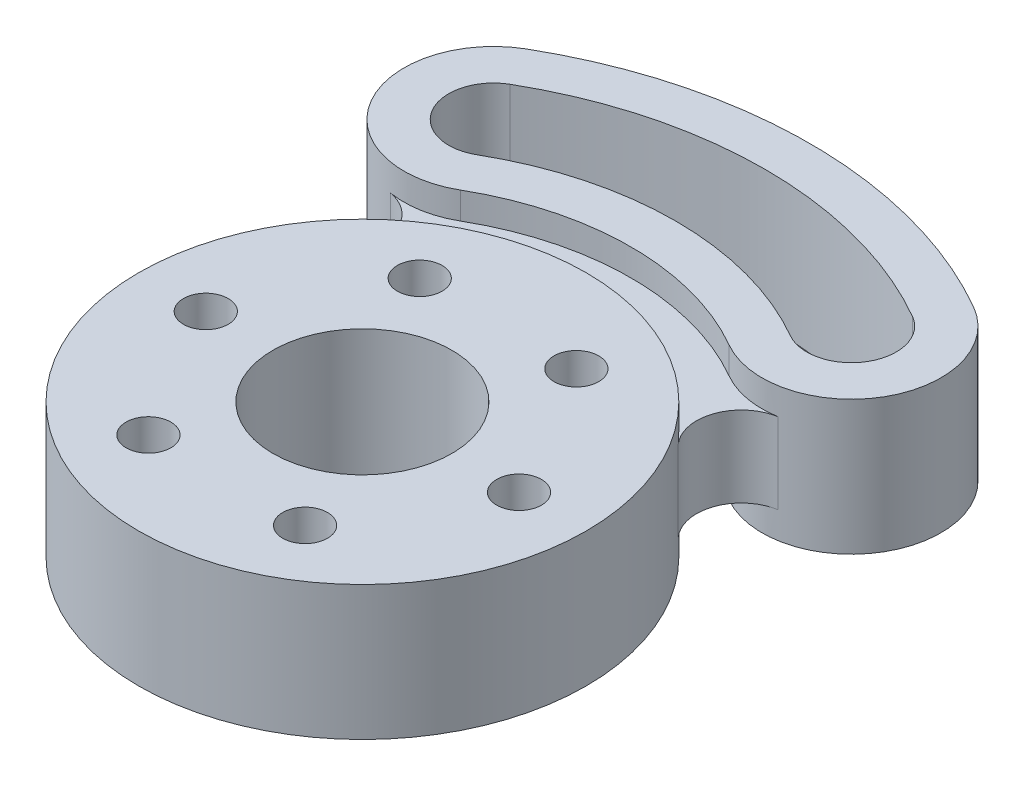
ISO-10303-21;
HEADER;
FILE_DESCRIPTION(('STEP AP214'),'2;1');
FILE_NAME('part.step','',(''),(''),'','','');
FILE_SCHEMA(('AUTOMOTIVE_DESIGN { 1 0 10303 214 1 1 1 1 }'));
ENDSEC;
DATA;
#1=APPLICATION_CONTEXT('core data for automotive mechanical design processes');
#2=APPLICATION_PROTOCOL_DEFINITION('international standard','automotive_design',2000,#1);
#3=PRODUCT_CONTEXT('',#1,'mechanical');
#4=PRODUCT('Part','Part','',(#3));
#5=PRODUCT_RELATED_PRODUCT_CATEGORY('part','',(#4));
#6=PRODUCT_DEFINITION_FORMATION('','',#4);
#7=PRODUCT_DEFINITION_CONTEXT('part definition',#1,'design');
#8=PRODUCT_DEFINITION('design','',#6,#7);
#9=PRODUCT_DEFINITION_SHAPE('','',#8);
#10=(LENGTH_UNIT() NAMED_UNIT(*) SI_UNIT(.MILLI.,.METRE.));
#11=(NAMED_UNIT(*) PLANE_ANGLE_UNIT() SI_UNIT($,.RADIAN.));
#12=(NAMED_UNIT(*) SI_UNIT($,.STERADIAN.) SOLID_ANGLE_UNIT());
#13=UNCERTAINTY_MEASURE_WITH_UNIT(LENGTH_MEASURE(1.E-05),#10,'distance_accuracy_value','');
#14=(GEOMETRIC_REPRESENTATION_CONTEXT(3) GLOBAL_UNCERTAINTY_ASSIGNED_CONTEXT((#13)) GLOBAL_UNIT_ASSIGNED_CONTEXT((#10,
#11,#12)) REPRESENTATION_CONTEXT('',''));
#15=CARTESIAN_POINT('',(0.,0.,0.));
#16=DIRECTION('',(0.,0.,1.));
#17=DIRECTION('',(1.,0.,0.));
#18=AXIS2_PLACEMENT_3D('',#15,#16,#17);
#19=CARTESIAN_POINT('',(0.,15.,0.));
#20=DIRECTION('',(0.,-1.,0.));
#21=DIRECTION('',(0.,0.,-1.));
#22=AXIS2_PLACEMENT_3D('',#19,#20,#21);
#23=CYLINDRICAL_SURFACE('',#22,60.);
#24=DIRECTION('',(0.,-1.,0.));
#25=VECTOR('',#24,1.);
#26=CARTESIAN_POINT('',(30.0000000000001,15.,-51.9615242270663));
#27=LINE('',#26,#25);
#28=CARTESIAN_POINT('',(30.0000000000001,-9.,-51.9615242270663));
#29=VERTEX_POINT('',#28);
#30=CARTESIAN_POINT('',(30.0000000000001,-15.,-51.9615242270663));
#31=VERTEX_POINT('',#30);
#32=EDGE_CURVE('E57',#29,#31,#27,.T.);
#33=ORIENTED_EDGE('',*,*,#32,.F.);
#34=CARTESIAN_POINT('',(0.,-9.,0.));
#35=DIRECTION('',(0.,1.,0.));
#36=DIRECTION('',(0.,0.,1.));
#37=AXIS2_PLACEMENT_3D('',#34,#35,#36);
#38=CIRCLE('',#37,60.);
#39=CARTESIAN_POINT('',(-30.0000000000001,-9.,-51.9615242270663));
#40=VERTEX_POINT('',#39);
#41=EDGE_CURVE('E174',#29,#40,#38,.T.);
#42=ORIENTED_EDGE('',*,*,#41,.T.);
#43=DIRECTION('',(0.,-1.,0.));
#44=VECTOR('',#43,1.);
#45=CARTESIAN_POINT('',(-30.0000000000001,15.,-51.9615242270663));
#46=LINE('',#45,#44);
#47=CARTESIAN_POINT('',(-30.0000000000001,-15.,-51.9615242270663));
#48=VERTEX_POINT('',#47);
#49=EDGE_CURVE('E241',#40,#48,#46,.T.);
#50=ORIENTED_EDGE('',*,*,#49,.T.);
#51=CARTESIAN_POINT('',(0.,-15.,0.));
#52=DIRECTION('',(0.,1.,0.));
#53=DIRECTION('',(0.,0.,1.));
#54=AXIS2_PLACEMENT_3D('',#51,#52,#53);
#55=CIRCLE('',#54,60.);
#56=EDGE_CURVE('E226',#31,#48,#55,.T.);
#57=ORIENTED_EDGE('',*,*,#56,.F.);
#58=EDGE_LOOP('',(#33,#42,#50,#57));
#59=FACE_BOUND('',#58,.T.);
#60=ADVANCED_FACE('F48',(#59),#23,.F.);
#61=CARTESIAN_POINT('',(0.,9.,0.));
#62=DIRECTION('',(0.,1.,0.));
#63=DIRECTION('',(0.,0.,1.));
#64=AXIS2_PLACEMENT_3D('',#61,#62,#63);
#65=CIRCLE('',#64,60.);
#66=CARTESIAN_POINT('',(30.0000000000001,9.,-51.9615242270663));
#67=VERTEX_POINT('',#66);
#68=CARTESIAN_POINT('',(-30.0000000000001,9.,-51.9615242270663));
#69=VERTEX_POINT('',#68);
#70=EDGE_CURVE('E277',#67,#69,#65,.T.);
#71=ORIENTED_EDGE('',*,*,#70,.F.);
#72=CARTESIAN_POINT('',(30.0000000000001,15.,-51.9615242270663));
#73=VERTEX_POINT('',#72);
#74=EDGE_CURVE('E12',#73,#67,#27,.T.);
#75=ORIENTED_EDGE('',*,*,#74,.F.);
#76=CARTESIAN_POINT('',(0.,15.,0.));
#77=DIRECTION('',(0.,1.,0.));
#78=DIRECTION('',(0.,0.,1.));
#79=AXIS2_PLACEMENT_3D('',#76,#77,#78);
#80=CIRCLE('',#79,60.);
#81=CARTESIAN_POINT('',(-30.0000000000001,15.,-51.9615242270663));
#82=VERTEX_POINT('',#81);
#83=EDGE_CURVE('E203',#73,#82,#80,.T.);
#84=ORIENTED_EDGE('',*,*,#83,.T.);
#85=EDGE_CURVE('E237',#82,#69,#46,.T.);
#86=ORIENTED_EDGE('',*,*,#85,.T.);
#87=EDGE_LOOP('',(#71,#75,#84,#86));
#88=FACE_BOUND('',#87,.T.);
#89=ADVANCED_FACE('F366',(#88),#23,.F.);
#90=CARTESIAN_POINT('',(40.0000000000001,15.,-69.282032302755));
#91=DIRECTION('',(0.,-1.,0.));
#92=DIRECTION('',(0.,0.,-1.));
#93=AXIS2_PLACEMENT_3D('',#90,#91,#92);
#94=CYLINDRICAL_SURFACE('',#93,20.);
#95=ORIENTED_EDGE('',*,*,#74,.T.);
#96=CARTESIAN_POINT('',(40.0000000000001,9.,-69.282032302755));
#97=DIRECTION('',(0.,1.,0.));
#98=DIRECTION('',(0.,0.,1.));
#99=AXIS2_PLACEMENT_3D('',#96,#97,#98);
#100=CIRCLE('',#99,20.);
#101=CARTESIAN_POINT('',(43.3254688973879,9.,-49.560438639653));
#102=VERTEX_POINT('',#101);
#103=EDGE_CURVE('E64',#67,#102,#100,.T.);
#104=ORIENTED_EDGE('',*,*,#103,.T.);
#105=DIRECTION('',(0.,-1.,0.));
#106=VECTOR('',#105,1.);
#107=CARTESIAN_POINT('',(43.3254688973879,9.,-49.560438639653));
#108=LINE('',#107,#106);
#109=CARTESIAN_POINT('',(43.3254688973879,-9.,-49.560438639653));
#110=VERTEX_POINT('',#109);
#111=EDGE_CURVE('E68',#102,#110,#108,.T.);
#112=ORIENTED_EDGE('',*,*,#111,.T.);
#113=CARTESIAN_POINT('',(40.0000000000001,-9.,-69.282032302755));
#114=DIRECTION('',(0.,1.,0.));
#115=DIRECTION('',(0.,0.,1.));
#116=AXIS2_PLACEMENT_3D('',#113,#114,#115);
#117=CIRCLE('',#116,20.);
#118=EDGE_CURVE('E172',#29,#110,#117,.T.);
#119=ORIENTED_EDGE('',*,*,#118,.F.);
#120=ORIENTED_EDGE('',*,*,#32,.T.);
#121=CARTESIAN_POINT('',(40.0000000000001,-15.,-69.282032302755));
#122=DIRECTION('',(0.,1.,0.));
#123=DIRECTION('',(0.,0.,1.));
#124=AXIS2_PLACEMENT_3D('',#121,#122,#123);
#125=CIRCLE('',#124,20.);
#126=CARTESIAN_POINT('',(50.0000000000001,-15.,-86.6025403784438));
#127=VERTEX_POINT('',#126);
#128=EDGE_CURVE('E229',#31,#127,#125,.T.);
#129=ORIENTED_EDGE('',*,*,#128,.T.);
#130=DIRECTION('',(0.,-1.,0.));
#131=VECTOR('',#130,1.);
#132=CARTESIAN_POINT('',(50.0000000000001,15.,-86.6025403784438));
#133=LINE('',#132,#131);
#134=CARTESIAN_POINT('',(50.0000000000001,15.,-86.6025403784438));
#135=VERTEX_POINT('',#134);
#136=EDGE_CURVE('E244',#135,#127,#133,.T.);
#137=ORIENTED_EDGE('',*,*,#136,.F.);
#138=CARTESIAN_POINT('',(40.0000000000001,15.,-69.282032302755));
#139=DIRECTION('',(0.,1.,0.));
#140=DIRECTION('',(0.,0.,1.));
#141=AXIS2_PLACEMENT_3D('',#138,#139,#140);
#142=CIRCLE('',#141,20.);
#143=EDGE_CURVE('E206',#73,#135,#142,.T.);
#144=ORIENTED_EDGE('',*,*,#143,.F.);
#145=EDGE_LOOP('',(#95,#104,#112,#119,#120,#129,#137,#144));
#146=FACE_BOUND('',#145,.T.);
#147=ADVANCED_FACE('F265',(#146),#94,.T.);
#148=CARTESIAN_POINT('',(0.,15.,0.));
#149=DIRECTION('',(0.,-1.,0.));
#150=DIRECTION('',(0.,0.,-1.));
#151=AXIS2_PLACEMENT_3D('',#148,#149,#150);
#152=CYLINDRICAL_SURFACE('',#151,100.);
#153=CARTESIAN_POINT('',(0.,-15.,0.));
#154=DIRECTION('',(0.,1.,0.));
#155=DIRECTION('',(0.,0.,1.));
#156=AXIS2_PLACEMENT_3D('',#153,#154,#155);
#157=CIRCLE('',#156,100.);
#158=CARTESIAN_POINT('',(-50.0000000000001,-15.,-86.6025403784438));
#159=VERTEX_POINT('',#158);
#160=EDGE_CURVE('E232',#127,#159,#157,.T.);
#161=ORIENTED_EDGE('',*,*,#160,.T.);
#162=DIRECTION('',(0.,-1.,0.));
#163=VECTOR('',#162,1.);
#164=CARTESIAN_POINT('',(-50.0000000000001,15.,-86.6025403784438));
#165=LINE('',#164,#163);
#166=CARTESIAN_POINT('',(-50.0000000000001,15.,-86.6025403784438));
#167=VERTEX_POINT('',#166);
#168=EDGE_CURVE('E240',#167,#159,#165,.T.);
#169=ORIENTED_EDGE('',*,*,#168,.F.);
#170=CARTESIAN_POINT('',(0.,15.,0.));
#171=DIRECTION('',(0.,1.,0.));
#172=DIRECTION('',(0.,0.,1.));
#173=AXIS2_PLACEMENT_3D('',#170,#171,#172);
#174=CIRCLE('',#173,100.);
#175=EDGE_CURVE('E209',#135,#167,#174,.T.);
#176=ORIENTED_EDGE('',*,*,#175,.F.);
#177=ORIENTED_EDGE('',*,*,#136,.T.);
#178=EDGE_LOOP('',(#161,#169,#176,#177));
#179=FACE_BOUND('',#178,.T.);
#180=ADVANCED_FACE('F386',(#179),#152,.T.);
#181=CARTESIAN_POINT('',(-40.0000000000001,15.,-69.282032302755));
#182=DIRECTION('',(0.,-1.,0.));
#183=DIRECTION('',(0.,0.,-1.));
#184=AXIS2_PLACEMENT_3D('',#181,#182,#183);
#185=CYLINDRICAL_SURFACE('',#184,10.);
#186=CARTESIAN_POINT('',(-40.0000000000001,-15.,-69.282032302755));
#187=DIRECTION('',(0.,1.,0.));
#188=DIRECTION('',(0.,0.,1.));
#189=AXIS2_PLACEMENT_3D('',#186,#187,#188);
#190=CIRCLE('',#189,10.);
#191=CARTESIAN_POINT('',(-45.0000000000001,-15.,-77.9422863405995));
#192=VERTEX_POINT('',#191);
#193=CARTESIAN_POINT('',(-35.0000000000001,-15.,-60.6217782649107));
#194=VERTEX_POINT('',#193);
#195=EDGE_CURVE('E190',#192,#194,#190,.T.);
#196=ORIENTED_EDGE('',*,*,#195,.F.);
#197=DIRECTION('',(0.,-1.,0.));
#198=VECTOR('',#197,1.);
#199=CARTESIAN_POINT('',(-45.0000000000001,15.,-77.9422863405995));
#200=LINE('',#199,#198);
#201=CARTESIAN_POINT('',(-45.0000000000001,15.,-77.9422863405995));
#202=VERTEX_POINT('',#201);
#203=EDGE_CURVE('E52',#202,#192,#200,.T.);
#204=ORIENTED_EDGE('',*,*,#203,.F.);
#205=CARTESIAN_POINT('',(-40.0000000000001,15.,-69.282032302755));
#206=DIRECTION('',(0.,1.,0.));
#207=DIRECTION('',(0.,0.,1.));
#208=AXIS2_PLACEMENT_3D('',#205,#206,#207);
#209=CIRCLE('',#208,10.);
#210=CARTESIAN_POINT('',(-35.0000000000001,15.,-60.6217782649107));
#211=VERTEX_POINT('',#210);
#212=EDGE_CURVE('E191',#202,#211,#209,.T.);
#213=ORIENTED_EDGE('',*,*,#212,.T.);
#214=DIRECTION('',(0.,-1.,0.));
#215=VECTOR('',#214,1.);
#216=CARTESIAN_POINT('',(-35.0000000000001,15.,-60.6217782649107));
#217=LINE('',#216,#215);
#218=EDGE_CURVE('E214',#211,#194,#217,.T.);
#219=ORIENTED_EDGE('',*,*,#218,.T.);
#220=EDGE_LOOP('',(#196,#204,#213,#219));
#221=FACE_BOUND('',#220,.T.);
#222=ADVANCED_FACE('F50',(#221),#185,.F.);
#223=CARTESIAN_POINT('',(0.,15.,0.));
#224=DIRECTION('',(0.,-1.,0.));
#225=DIRECTION('',(0.,0.,-1.));
#226=AXIS2_PLACEMENT_3D('',#223,#224,#225);
#227=CYLINDRICAL_SURFACE('',#226,90.0000000000001);
#228=CARTESIAN_POINT('',(0.,-15.,0.));
#229=DIRECTION('',(0.,1.,0.));
#230=DIRECTION('',(0.,0.,1.));
#231=AXIS2_PLACEMENT_3D('',#228,#229,#230);
#232=CIRCLE('',#231,90.0000000000001);
#233=CARTESIAN_POINT('',(45.0000000000002,-15.,-77.9422863405995));
#234=VERTEX_POINT('',#233);
#235=EDGE_CURVE('E217',#234,#192,#232,.T.);
#236=ORIENTED_EDGE('',*,*,#235,.F.);
#237=DIRECTION('',(0.,-1.,0.));
#238=VECTOR('',#237,1.);
#239=CARTESIAN_POINT('',(45.0000000000002,15.,-77.9422863405995));
#240=LINE('',#239,#238);
#241=CARTESIAN_POINT('',(45.0000000000002,15.,-77.9422863405995));
#242=VERTEX_POINT('',#241);
#243=EDGE_CURVE('E249',#242,#234,#240,.T.);
#244=ORIENTED_EDGE('',*,*,#243,.F.);
#245=CARTESIAN_POINT('',(0.,15.,0.));
#246=DIRECTION('',(0.,1.,0.));
#247=DIRECTION('',(0.,0.,1.));
#248=AXIS2_PLACEMENT_3D('',#245,#246,#247);
#249=CIRCLE('',#248,90.0000000000001);
#250=EDGE_CURVE('E194',#242,#202,#249,.T.);
#251=ORIENTED_EDGE('',*,*,#250,.T.);
#252=ORIENTED_EDGE('',*,*,#203,.T.);
#253=EDGE_LOOP('',(#236,#244,#251,#252));
#254=FACE_BOUND('',#253,.T.);
#255=ADVANCED_FACE('F381',(#254),#227,.F.);
#256=CARTESIAN_POINT('',(40.0000000000001,15.,-69.282032302755));
#257=DIRECTION('',(0.,-1.,0.));
#258=DIRECTION('',(0.,0.,-1.));
#259=AXIS2_PLACEMENT_3D('',#256,#257,#258);
#260=CYLINDRICAL_SURFACE('',#259,10.);
#261=CARTESIAN_POINT('',(40.0000000000001,-15.,-69.282032302755));
#262=DIRECTION('',(0.,1.,0.));
#263=DIRECTION('',(0.,0.,1.));
#264=AXIS2_PLACEMENT_3D('',#261,#262,#263);
#265=CIRCLE('',#264,10.);
#266=CARTESIAN_POINT('',(35.0000000000001,-15.,-60.6217782649107));
#267=VERTEX_POINT('',#266);
#268=EDGE_CURVE('E220',#267,#234,#265,.T.);
#269=ORIENTED_EDGE('',*,*,#268,.F.);
#270=DIRECTION('',(0.,-1.,0.));
#271=VECTOR('',#270,1.);
#272=CARTESIAN_POINT('',(35.0000000000001,15.,-60.6217782649107));
#273=LINE('',#272,#271);
#274=CARTESIAN_POINT('',(35.0000000000001,15.,-60.6217782649107));
#275=VERTEX_POINT('',#274);
#276=EDGE_CURVE('E248',#275,#267,#273,.T.);
#277=ORIENTED_EDGE('',*,*,#276,.F.);
#278=CARTESIAN_POINT('',(40.0000000000001,15.,-69.282032302755));
#279=DIRECTION('',(0.,1.,0.));
#280=DIRECTION('',(0.,0.,1.));
#281=AXIS2_PLACEMENT_3D('',#278,#279,#280);
#282=CIRCLE('',#281,10.);
#283=EDGE_CURVE('E198',#275,#242,#282,.T.);
#284=ORIENTED_EDGE('',*,*,#283,.T.);
#285=ORIENTED_EDGE('',*,*,#243,.T.);
#286=EDGE_LOOP('',(#269,#277,#284,#285));
#287=FACE_BOUND('',#286,.T.);
#288=ADVANCED_FACE('F378',(#287),#260,.F.);
#289=CARTESIAN_POINT('',(0.,15.,0.));
#290=DIRECTION('',(0.,-1.,0.));
#291=DIRECTION('',(0.,0.,-1.));
#292=AXIS2_PLACEMENT_3D('',#289,#290,#291);
#293=CYLINDRICAL_SURFACE('',#292,70.);
#294=CARTESIAN_POINT('',(0.,-15.,0.));
#295=DIRECTION('',(0.,1.,0.));
#296=DIRECTION('',(0.,0.,1.));
#297=AXIS2_PLACEMENT_3D('',#294,#295,#296);
#298=CIRCLE('',#297,70.);
#299=EDGE_CURVE('E223',#267,#194,#298,.T.);
#300=ORIENTED_EDGE('',*,*,#299,.T.);
#301=ORIENTED_EDGE('',*,*,#218,.F.);
#302=CARTESIAN_POINT('',(0.,15.,0.));
#303=DIRECTION('',(0.,1.,0.));
#304=DIRECTION('',(0.,0.,1.));
#305=AXIS2_PLACEMENT_3D('',#302,#303,#304);
#306=CIRCLE('',#305,70.);
#307=EDGE_CURVE('E201',#275,#211,#306,.T.);
#308=ORIENTED_EDGE('',*,*,#307,.F.);
#309=ORIENTED_EDGE('',*,*,#276,.T.);
#310=EDGE_LOOP('',(#300,#301,#308,#309));
#311=FACE_BOUND('',#310,.T.);
#312=ADVANCED_FACE('F375',(#311),#293,.T.);
#313=CARTESIAN_POINT('',(-40.0000000000001,15.,-69.282032302755));
#314=DIRECTION('',(0.,-1.,0.));
#315=DIRECTION('',(0.,0.,-1.));
#316=AXIS2_PLACEMENT_3D('',#313,#314,#315);
#317=CYLINDRICAL_SURFACE('',#316,20.);
#318=DIRECTION('',(0.,-1.,0.));
#319=VECTOR('',#318,1.);
#320=CARTESIAN_POINT('',(-43.3254688973879,9.,-49.560438639653));
#321=LINE('',#320,#319);
#322=CARTESIAN_POINT('',(-43.3254688973879,9.,-49.560438639653));
#323=VERTEX_POINT('',#322);
#324=CARTESIAN_POINT('',(-43.3254688973879,-9.,-49.560438639653));
#325=VERTEX_POINT('',#324);
#326=EDGE_CURVE('E184',#323,#325,#321,.T.);
#327=ORIENTED_EDGE('',*,*,#326,.F.);
#328=CARTESIAN_POINT('',(-40.0000000000001,9.,-69.282032302755));
#329=DIRECTION('',(0.,1.,0.));
#330=DIRECTION('',(0.,0.,1.));
#331=AXIS2_PLACEMENT_3D('',#328,#329,#330);
#332=CIRCLE('',#331,20.);
#333=EDGE_CURVE('E187',#323,#69,#332,.T.);
#334=ORIENTED_EDGE('',*,*,#333,.T.);
#335=ORIENTED_EDGE('',*,*,#85,.F.);
#336=CARTESIAN_POINT('',(-40.0000000000001,15.,-69.282032302755));
#337=DIRECTION('',(0.,1.,0.));
#338=DIRECTION('',(0.,0.,1.));
#339=AXIS2_PLACEMENT_3D('',#336,#337,#338);
#340=CIRCLE('',#339,20.);
#341=EDGE_CURVE('E212',#167,#82,#340,.T.);
#342=ORIENTED_EDGE('',*,*,#341,.F.);
#343=ORIENTED_EDGE('',*,*,#168,.T.);
#344=CARTESIAN_POINT('',(-40.0000000000001,-15.,-69.282032302755));
#345=DIRECTION('',(0.,1.,0.));
#346=DIRECTION('',(0.,0.,1.));
#347=AXIS2_PLACEMENT_3D('',#344,#345,#346);
#348=CIRCLE('',#347,20.);
#349=EDGE_CURVE('E195',#159,#48,#348,.T.);
#350=ORIENTED_EDGE('',*,*,#349,.T.);
#351=ORIENTED_EDGE('',*,*,#49,.F.);
#352=CARTESIAN_POINT('',(-40.0000000000001,-9.,-69.282032302755));
#353=DIRECTION('',(0.,1.,0.));
#354=DIRECTION('',(0.,0.,1.));
#355=AXIS2_PLACEMENT_3D('',#352,#353,#354);
#356=CIRCLE('',#355,20.);
#357=EDGE_CURVE('E180',#325,#40,#356,.T.);
#358=ORIENTED_EDGE('',*,*,#357,.F.);
#359=EDGE_LOOP('',(#327,#334,#335,#342,#343,#350,#351,#358));
#360=FACE_BOUND('',#359,.T.);
#361=ADVANCED_FACE('F259',(#360),#317,.T.);
#362=CARTESIAN_POINT('',(0.,15.,0.));
#363=DIRECTION('',(0.,1.,0.));
#364=DIRECTION('',(0.,0.,1.));
#365=AXIS2_PLACEMENT_3D('',#362,#363,#364);
#366=PLANE('',#365);
#367=ORIENTED_EDGE('',*,*,#212,.F.);
#368=ORIENTED_EDGE('',*,*,#250,.F.);
#369=ORIENTED_EDGE('',*,*,#283,.F.);
#370=ORIENTED_EDGE('',*,*,#307,.T.);
#371=EDGE_LOOP('',(#367,#368,#369,#370));
#372=FACE_BOUND('',#371,.T.);
#373=ORIENTED_EDGE('',*,*,#83,.F.);
#374=ORIENTED_EDGE('',*,*,#143,.T.);
#375=ORIENTED_EDGE('',*,*,#175,.T.);
#376=ORIENTED_EDGE('',*,*,#341,.T.);
#377=EDGE_LOOP('',(#373,#374,#375,#376));
#378=FACE_BOUND('',#377,.T.);
#379=ADVANCED_FACE('F396',(#372,#378),#366,.T.);
#380=CARTESIAN_POINT('',(0.,-15.,0.));
#381=DIRECTION('',(0.,1.,0.));
#382=DIRECTION('',(0.,0.,1.));
#383=AXIS2_PLACEMENT_3D('',#380,#381,#382);
#384=PLANE('',#383);
#385=ORIENTED_EDGE('',*,*,#195,.T.);
#386=ORIENTED_EDGE('',*,*,#299,.F.);
#387=ORIENTED_EDGE('',*,*,#268,.T.);
#388=ORIENTED_EDGE('',*,*,#235,.T.);
#389=EDGE_LOOP('',(#385,#386,#387,#388));
#390=FACE_BOUND('',#389,.T.);
#391=ORIENTED_EDGE('',*,*,#56,.T.);
#392=ORIENTED_EDGE('',*,*,#349,.F.);
#393=ORIENTED_EDGE('',*,*,#160,.F.);
#394=ORIENTED_EDGE('',*,*,#128,.F.);
#395=EDGE_LOOP('',(#391,#392,#393,#394));
#396=FACE_BOUND('',#395,.T.);
#397=ADVANCED_FACE('F263',(#390,#396),#384,.F.);
#398=CARTESIAN_POINT('',(-44.9882033460818,9.,-39.699641808102));
#399=DIRECTION('',(0.,-1.,0.));
#400=DIRECTION('',(0.,0.,-1.));
#401=AXIS2_PLACEMENT_3D('',#398,#399,#400);
#402=CYLINDRICAL_SURFACE('',#401,10.);
#403=CARTESIAN_POINT('',(-44.9882033460818,-9.,-39.699641808102));
#404=DIRECTION('',(0.,1.,0.));
#405=DIRECTION('',(0.,0.,1.));
#406=AXIS2_PLACEMENT_3D('',#403,#404,#405);
#407=CIRCLE('',#406,10.);
#408=CARTESIAN_POINT('',(-37.4901694550682,-9.,-33.083034840085));
#409=VERTEX_POINT('',#408);
#410=EDGE_CURVE('E161',#409,#325,#407,.T.);
#411=ORIENTED_EDGE('',*,*,#410,.F.);
#412=DIRECTION('',(0.,-1.,0.));
#413=VECTOR('',#412,1.);
#414=CARTESIAN_POINT('',(-37.4901694550682,9.,-33.083034840085));
#415=LINE('',#414,#413);
#416=CARTESIAN_POINT('',(-37.4901694550682,9.,-33.083034840085));
#417=VERTEX_POINT('',#416);
#418=EDGE_CURVE('E155',#417,#409,#415,.T.);
#419=ORIENTED_EDGE('',*,*,#418,.F.);
#420=CARTESIAN_POINT('',(-44.9882033460818,9.,-39.699641808102));
#421=DIRECTION('',(0.,1.,0.));
#422=DIRECTION('',(0.,0.,1.));
#423=AXIS2_PLACEMENT_3D('',#420,#421,#422);
#424=CIRCLE('',#423,10.);
#425=EDGE_CURVE('E183',#417,#323,#424,.T.);
#426=ORIENTED_EDGE('',*,*,#425,.T.);
#427=ORIENTED_EDGE('',*,*,#326,.T.);
#428=EDGE_LOOP('',(#411,#419,#426,#427));
#429=FACE_BOUND('',#428,.T.);
#430=ADVANCED_FACE('F269',(#429),#402,.F.);
#431=CARTESIAN_POINT('',(44.9882033460818,9.,-39.699641808102));
#432=DIRECTION('',(0.,-1.,0.));
#433=DIRECTION('',(0.,0.,-1.));
#434=AXIS2_PLACEMENT_3D('',#431,#432,#433);
#435=CYLINDRICAL_SURFACE('',#434,10.);
#436=CARTESIAN_POINT('',(44.9882033460818,-9.,-39.699641808102));
#437=DIRECTION('',(0.,1.,0.));
#438=DIRECTION('',(0.,0.,1.));
#439=AXIS2_PLACEMENT_3D('',#436,#437,#438);
#440=CIRCLE('',#439,10.);
#441=CARTESIAN_POINT('',(37.4901694550682,-9.,-33.083034840085));
#442=VERTEX_POINT('',#441);
#443=EDGE_CURVE('E160',#110,#442,#440,.T.);
#444=ORIENTED_EDGE('',*,*,#443,.F.);
#445=ORIENTED_EDGE('',*,*,#111,.F.);
#446=CARTESIAN_POINT('',(44.9882033460818,9.,-39.699641808102));
#447=DIRECTION('',(0.,1.,0.));
#448=DIRECTION('',(0.,0.,1.));
#449=AXIS2_PLACEMENT_3D('',#446,#447,#448);
#450=CIRCLE('',#449,10.);
#451=CARTESIAN_POINT('',(37.4901694550682,9.,-33.083034840085));
#452=VERTEX_POINT('',#451);
#453=EDGE_CURVE('E168',#102,#452,#450,.T.);
#454=ORIENTED_EDGE('',*,*,#453,.T.);
#455=DIRECTION('',(0.,-1.,0.));
#456=VECTOR('',#455,1.);
#457=CARTESIAN_POINT('',(37.4901694550682,9.,-33.083034840085));
#458=LINE('',#457,#456);
#459=EDGE_CURVE('E152',#452,#442,#458,.T.);
#460=ORIENTED_EDGE('',*,*,#459,.T.);
#461=EDGE_LOOP('',(#444,#445,#454,#460));
#462=FACE_BOUND('',#461,.T.);
#463=ADVANCED_FACE('F165',(#462),#435,.F.);
#464=CARTESIAN_POINT('',(0.,9.,0.));
#465=DIRECTION('',(0.,1.,0.));
#466=DIRECTION('',(0.,0.,1.));
#467=AXIS2_PLACEMENT_3D('',#464,#465,#466);
#468=PLANE('',#467);
#469=ORIENTED_EDGE('',*,*,#425,.F.);
#470=CARTESIAN_POINT('',(0.,9.,0.));
#471=DIRECTION('',(0.,1.,0.));
#472=DIRECTION('',(0.,0.,1.));
#473=AXIS2_PLACEMENT_3D('',#470,#471,#472);
#474=CIRCLE('',#473,50.);
#475=EDGE_CURVE('E273',#452,#417,#474,.T.);
#476=ORIENTED_EDGE('',*,*,#475,.F.);
#477=ORIENTED_EDGE('',*,*,#453,.F.);
#478=ORIENTED_EDGE('',*,*,#103,.F.);
#479=ORIENTED_EDGE('',*,*,#70,.T.);
#480=ORIENTED_EDGE('',*,*,#333,.F.);
#481=EDGE_LOOP('',(#469,#476,#477,#478,#479,#480));
#482=FACE_BOUND('',#481,.T.);
#483=ADVANCED_FACE('F276',(#482),#468,.T.);
#484=CARTESIAN_POINT('',(0.,-9.,0.));
#485=DIRECTION('',(0.,1.,0.));
#486=DIRECTION('',(0.,0.,1.));
#487=AXIS2_PLACEMENT_3D('',#484,#485,#486);
#488=PLANE('',#487);
#489=ORIENTED_EDGE('',*,*,#410,.T.);
#490=ORIENTED_EDGE('',*,*,#357,.T.);
#491=ORIENTED_EDGE('',*,*,#41,.F.);
#492=ORIENTED_EDGE('',*,*,#118,.T.);
#493=ORIENTED_EDGE('',*,*,#443,.T.);
#494=CARTESIAN_POINT('',(0.,-9.,0.));
#495=DIRECTION('',(0.,1.,0.));
#496=DIRECTION('',(0.,0.,1.));
#497=AXIS2_PLACEMENT_3D('',#494,#495,#496);
#498=CIRCLE('',#497,50.);
#499=EDGE_CURVE('E148',#442,#409,#498,.T.);
#500=ORIENTED_EDGE('',*,*,#499,.T.);
#501=EDGE_LOOP('',(#489,#490,#491,#492,#493,#500));
#502=FACE_BOUND('',#501,.T.);
#503=ADVANCED_FACE('F170',(#502),#488,.F.);
#504=CARTESIAN_POINT('',(0.,15.,0.));
#505=DIRECTION('',(0.,-1.,0.));
#506=DIRECTION('',(0.,0.,-1.));
#507=AXIS2_PLACEMENT_3D('',#504,#505,#506);
#508=CYLINDRICAL_SURFACE('',#507,20.);
#509=CARTESIAN_POINT('',(0.,15.,0.));
#510=DIRECTION('',(0.,1.,0.));
#511=DIRECTION('',(0.,0.,1.));
#512=AXIS2_PLACEMENT_3D('',#509,#510,#511);
#513=CIRCLE('',#512,20.);
#514=CARTESIAN_POINT('',(0.,15.,20.));
#515=VERTEX_POINT('',#514);
#516=EDGE_CURVE('E284',#515,#515,#513,.T.);
#517=ORIENTED_EDGE('',*,*,#516,.T.);
#518=EDGE_LOOP('',(#517));
#519=FACE_BOUND('',#518,.T.);
#520=CARTESIAN_POINT('',(0.,-15.,0.));
#521=DIRECTION('',(0.,1.,0.));
#522=DIRECTION('',(0.,0.,1.));
#523=AXIS2_PLACEMENT_3D('',#520,#521,#522);
#524=CIRCLE('',#523,20.);
#525=CARTESIAN_POINT('',(0.,-15.,20.));
#526=VERTEX_POINT('',#525);
#527=EDGE_CURVE('E311',#526,#526,#524,.T.);
#528=ORIENTED_EDGE('',*,*,#527,.F.);
#529=EDGE_LOOP('',(#528));
#530=FACE_BOUND('',#529,.T.);
#531=ADVANCED_FACE('F351',(#519,#530),#508,.F.);
#532=CARTESIAN_POINT('',(35.,15.,0.));
#533=DIRECTION('',(0.,-1.,0.));
#534=DIRECTION('',(0.,0.,-1.));
#535=AXIS2_PLACEMENT_3D('',#532,#533,#534);
#536=CYLINDRICAL_SURFACE('',#535,5.);
#537=CARTESIAN_POINT('',(35.,15.,0.));
#538=DIRECTION('',(0.,1.,0.));
#539=DIRECTION('',(0.,0.,1.));
#540=AXIS2_PLACEMENT_3D('',#537,#538,#539);
#541=CIRCLE('',#540,5.);
#542=CARTESIAN_POINT('',(35.,15.,5.));
#543=VERTEX_POINT('',#542);
#544=EDGE_CURVE('E289',#543,#543,#541,.T.);
#545=ORIENTED_EDGE('',*,*,#544,.T.);
#546=EDGE_LOOP('',(#545));
#547=FACE_BOUND('',#546,.T.);
#548=CARTESIAN_POINT('',(35.,-15.,0.));
#549=DIRECTION('',(0.,1.,0.));
#550=DIRECTION('',(0.,0.,1.));
#551=AXIS2_PLACEMENT_3D('',#548,#549,#550);
#552=CIRCLE('',#551,5.);
#553=CARTESIAN_POINT('',(35.,-15.,5.));
#554=VERTEX_POINT('',#553);
#555=EDGE_CURVE('E308',#554,#554,#552,.T.);
#556=ORIENTED_EDGE('',*,*,#555,.F.);
#557=EDGE_LOOP('',(#556));
#558=FACE_BOUND('',#557,.T.);
#559=ADVANCED_FACE('F340',(#547,#558),#536,.F.);
#560=CARTESIAN_POINT('',(17.4999999999999,15.,30.3108891324554));
#561=DIRECTION('',(0.,-1.,0.));
#562=DIRECTION('',(0.,0.,-1.));
#563=AXIS2_PLACEMENT_3D('',#560,#561,#562);
#564=CYLINDRICAL_SURFACE('',#563,5.);
#565=CARTESIAN_POINT('',(17.4999999999999,15.,30.3108891324554));
#566=DIRECTION('',(0.,1.,0.));
#567=DIRECTION('',(0.,0.,1.));
#568=AXIS2_PLACEMENT_3D('',#565,#566,#567);
#569=CIRCLE('',#568,5.);
#570=CARTESIAN_POINT('',(17.4999999999999,15.,35.3108891324554));
#571=VERTEX_POINT('',#570);
#572=EDGE_CURVE('E335',#571,#571,#569,.T.);
#573=ORIENTED_EDGE('',*,*,#572,.T.);
#574=EDGE_LOOP('',(#573));
#575=FACE_BOUND('',#574,.T.);
#576=CARTESIAN_POINT('',(17.4999999999999,-15.,30.3108891324554));
#577=DIRECTION('',(0.,1.,0.));
#578=DIRECTION('',(0.,0.,1.));
#579=AXIS2_PLACEMENT_3D('',#576,#577,#578);
#580=CIRCLE('',#579,5.);
#581=CARTESIAN_POINT('',(17.4999999999999,-15.,35.3108891324554));
#582=VERTEX_POINT('',#581);
#583=EDGE_CURVE('E305',#582,#582,#580,.T.);
#584=ORIENTED_EDGE('',*,*,#583,.F.);
#585=EDGE_LOOP('',(#584));
#586=FACE_BOUND('',#585,.T.);
#587=ADVANCED_FACE('F433',(#575,#586),#564,.F.);
#588=CARTESIAN_POINT('',(-17.5000000000001,15.,30.3108891324553));
#589=DIRECTION('',(0.,-1.,0.));
#590=DIRECTION('',(0.,0.,-1.));
#591=AXIS2_PLACEMENT_3D('',#588,#589,#590);
#592=CYLINDRICAL_SURFACE('',#591,5.);
#593=CARTESIAN_POINT('',(-17.5000000000001,15.,30.3108891324553));
#594=DIRECTION('',(0.,1.,0.));
#595=DIRECTION('',(0.,0.,1.));
#596=AXIS2_PLACEMENT_3D('',#593,#594,#595);
#597=CIRCLE('',#596,5.);
#598=CARTESIAN_POINT('',(-17.5000000000001,15.,35.3108891324553));
#599=VERTEX_POINT('',#598);
#600=EDGE_CURVE('E332',#599,#599,#597,.T.);
#601=ORIENTED_EDGE('',*,*,#600,.T.);
#602=EDGE_LOOP('',(#601));
#603=FACE_BOUND('',#602,.T.);
#604=CARTESIAN_POINT('',(-17.5000000000001,-15.,30.3108891324553));
#605=DIRECTION('',(0.,1.,0.));
#606=DIRECTION('',(0.,0.,1.));
#607=AXIS2_PLACEMENT_3D('',#604,#605,#606);
#608=CIRCLE('',#607,5.);
#609=CARTESIAN_POINT('',(-17.5000000000001,-15.,35.3108891324553));
#610=VERTEX_POINT('',#609);
#611=EDGE_CURVE('E302',#610,#610,#608,.T.);
#612=ORIENTED_EDGE('',*,*,#611,.F.);
#613=EDGE_LOOP('',(#612));
#614=FACE_BOUND('',#613,.T.);
#615=ADVANCED_FACE('F429',(#603,#614),#592,.F.);
#616=CARTESIAN_POINT('',(-35.,15.,-2.44403693719019E-13));
#617=DIRECTION('',(0.,-1.,0.));
#618=DIRECTION('',(0.,0.,-1.));
#619=AXIS2_PLACEMENT_3D('',#616,#617,#618);
#620=CYLINDRICAL_SURFACE('',#619,4.99999999999999);
#621=CARTESIAN_POINT('',(-35.,15.,-2.44403693719019E-13));
#622=DIRECTION('',(0.,1.,0.));
#623=DIRECTION('',(0.,0.,1.));
#624=AXIS2_PLACEMENT_3D('',#621,#622,#623);
#625=CIRCLE('',#624,4.99999999999999);
#626=CARTESIAN_POINT('',(-35.,15.,4.99999999999975));
#627=VERTEX_POINT('',#626);
#628=EDGE_CURVE('E327',#627,#627,#625,.T.);
#629=ORIENTED_EDGE('',*,*,#628,.T.);
#630=EDGE_LOOP('',(#629));
#631=FACE_BOUND('',#630,.T.);
#632=CARTESIAN_POINT('',(-35.,-15.,-2.44403693719019E-13));
#633=DIRECTION('',(0.,1.,0.));
#634=DIRECTION('',(0.,0.,1.));
#635=AXIS2_PLACEMENT_3D('',#632,#633,#634);
#636=CIRCLE('',#635,4.99999999999999);
#637=CARTESIAN_POINT('',(-35.,-15.,4.99999999999975));
#638=VERTEX_POINT('',#637);
#639=EDGE_CURVE('E299',#638,#638,#636,.T.);
#640=ORIENTED_EDGE('',*,*,#639,.F.);
#641=EDGE_LOOP('',(#640));
#642=FACE_BOUND('',#641,.T.);
#643=ADVANCED_FACE('F425',(#631,#642),#620,.F.);
#644=CARTESIAN_POINT('',(-17.4999999999997,15.,-30.3108891324555));
#645=DIRECTION('',(0.,-1.,0.));
#646=DIRECTION('',(0.,0.,-1.));
#647=AXIS2_PLACEMENT_3D('',#644,#645,#646);
#648=CYLINDRICAL_SURFACE('',#647,5.);
#649=CARTESIAN_POINT('',(-17.4999999999997,15.,-30.3108891324555));
#650=DIRECTION('',(0.,1.,0.));
#651=DIRECTION('',(0.,0.,1.));
#652=AXIS2_PLACEMENT_3D('',#649,#650,#651);
#653=CIRCLE('',#652,5.);
#654=CARTESIAN_POINT('',(-17.4999999999997,15.,-25.3108891324555));
#655=VERTEX_POINT('',#654);
#656=EDGE_CURVE('E322',#655,#655,#653,.T.);
#657=ORIENTED_EDGE('',*,*,#656,.T.);
#658=EDGE_LOOP('',(#657));
#659=FACE_BOUND('',#658,.T.);
#660=CARTESIAN_POINT('',(-17.4999999999997,-15.,-30.3108891324555));
#661=DIRECTION('',(0.,1.,0.));
#662=DIRECTION('',(0.,0.,1.));
#663=AXIS2_PLACEMENT_3D('',#660,#661,#662);
#664=CIRCLE('',#663,5.);
#665=CARTESIAN_POINT('',(-17.4999999999997,-15.,-25.3108891324555));
#666=VERTEX_POINT('',#665);
#667=EDGE_CURVE('E296',#666,#666,#664,.T.);
#668=ORIENTED_EDGE('',*,*,#667,.F.);
#669=EDGE_LOOP('',(#668));
#670=FACE_BOUND('',#669,.T.);
#671=ADVANCED_FACE('F422',(#659,#670),#648,.F.);
#672=CARTESIAN_POINT('',(17.5000000000004,15.,-30.3108891324552));
#673=DIRECTION('',(0.,-1.,0.));
#674=DIRECTION('',(0.,0.,-1.));
#675=AXIS2_PLACEMENT_3D('',#672,#673,#674);
#676=CYLINDRICAL_SURFACE('',#675,5.);
#677=CARTESIAN_POINT('',(17.5000000000004,15.,-30.3108891324552));
#678=DIRECTION('',(0.,1.,0.));
#679=DIRECTION('',(0.,0.,1.));
#680=AXIS2_PLACEMENT_3D('',#677,#678,#679);
#681=CIRCLE('',#680,5.);
#682=CARTESIAN_POINT('',(17.5000000000004,15.,-25.3108891324552));
#683=VERTEX_POINT('',#682);
#684=EDGE_CURVE('E316',#683,#683,#681,.T.);
#685=ORIENTED_EDGE('',*,*,#684,.T.);
#686=EDGE_LOOP('',(#685));
#687=FACE_BOUND('',#686,.T.);
#688=CARTESIAN_POINT('',(17.5000000000004,-15.,-30.3108891324552));
#689=DIRECTION('',(0.,1.,0.));
#690=DIRECTION('',(0.,0.,1.));
#691=AXIS2_PLACEMENT_3D('',#688,#689,#690);
#692=CIRCLE('',#691,5.);
#693=CARTESIAN_POINT('',(17.5000000000004,-15.,-25.3108891324552));
#694=VERTEX_POINT('',#693);
#695=EDGE_CURVE('E293',#694,#694,#692,.T.);
#696=ORIENTED_EDGE('',*,*,#695,.F.);
#697=EDGE_LOOP('',(#696));
#698=FACE_BOUND('',#697,.T.);
#699=ADVANCED_FACE('F419',(#687,#698),#676,.F.);
#700=CARTESIAN_POINT('',(0.,15.,0.));
#701=DIRECTION('',(0.,-1.,0.));
#702=DIRECTION('',(0.,0.,-1.));
#703=AXIS2_PLACEMENT_3D('',#700,#701,#702);
#704=CYLINDRICAL_SURFACE('',#703,50.);
#705=ORIENTED_EDGE('',*,*,#475,.T.);
#706=ORIENTED_EDGE('',*,*,#418,.T.);
#707=ORIENTED_EDGE('',*,*,#499,.F.);
#708=ORIENTED_EDGE('',*,*,#459,.F.);
#709=EDGE_LOOP('',(#705,#706,#707,#708));
#710=FACE_BOUND('',#709,.T.);
#711=CARTESIAN_POINT('',(0.,15.,0.));
#712=DIRECTION('',(0.,1.,0.));
#713=DIRECTION('',(0.,0.,1.));
#714=AXIS2_PLACEMENT_3D('',#711,#712,#713);
#715=CIRCLE('',#714,50.);
#716=CARTESIAN_POINT('',(0.,15.,50.));
#717=VERTEX_POINT('',#716);
#718=EDGE_CURVE('E282',#717,#717,#715,.T.);
#719=ORIENTED_EDGE('',*,*,#718,.F.);
#720=EDGE_LOOP('',(#719));
#721=FACE_BOUND('',#720,.T.);
#722=CARTESIAN_POINT('',(0.,-15.,0.));
#723=DIRECTION('',(0.,1.,0.));
#724=DIRECTION('',(0.,0.,1.));
#725=AXIS2_PLACEMENT_3D('',#722,#723,#724);
#726=CIRCLE('',#725,50.);
#727=CARTESIAN_POINT('',(0.,-15.,50.));
#728=VERTEX_POINT('',#727);
#729=EDGE_CURVE('E314',#728,#728,#726,.T.);
#730=ORIENTED_EDGE('',*,*,#729,.T.);
#731=EDGE_LOOP('',(#730));
#732=FACE_BOUND('',#731,.T.);
#733=ADVANCED_FACE('F150',(#710,#721,#732),#704,.T.);
#734=CARTESIAN_POINT('',(0.,15.,0.));
#735=DIRECTION('',(0.,1.,0.));
#736=DIRECTION('',(0.,0.,1.));
#737=AXIS2_PLACEMENT_3D('',#734,#735,#736);
#738=PLANE('',#737);
#739=ORIENTED_EDGE('',*,*,#684,.F.);
#740=EDGE_LOOP('',(#739));
#741=FACE_BOUND('',#740,.T.);
#742=ORIENTED_EDGE('',*,*,#656,.F.);
#743=EDGE_LOOP('',(#742));
#744=FACE_BOUND('',#743,.T.);
#745=ORIENTED_EDGE('',*,*,#628,.F.);
#746=EDGE_LOOP('',(#745));
#747=FACE_BOUND('',#746,.T.);
#748=ORIENTED_EDGE('',*,*,#600,.F.);
#749=EDGE_LOOP('',(#748));
#750=FACE_BOUND('',#749,.T.);
#751=ORIENTED_EDGE('',*,*,#572,.F.);
#752=EDGE_LOOP('',(#751));
#753=FACE_BOUND('',#752,.T.);
#754=ORIENTED_EDGE('',*,*,#544,.F.);
#755=EDGE_LOOP('',(#754));
#756=FACE_BOUND('',#755,.T.);
#757=ORIENTED_EDGE('',*,*,#516,.F.);
#758=EDGE_LOOP('',(#757));
#759=FACE_BOUND('',#758,.T.);
#760=ORIENTED_EDGE('',*,*,#718,.T.);
#761=EDGE_LOOP('',(#760));
#762=FACE_BOUND('',#761,.T.);
#763=ADVANCED_FACE('F343',(#741,#744,#747,#750,#753,#756,#759,#762),#738,.T.);
#764=CARTESIAN_POINT('',(0.,-15.,0.));
#765=DIRECTION('',(0.,1.,0.));
#766=DIRECTION('',(0.,0.,1.));
#767=AXIS2_PLACEMENT_3D('',#764,#765,#766);
#768=PLANE('',#767);
#769=ORIENTED_EDGE('',*,*,#695,.T.);
#770=EDGE_LOOP('',(#769));
#771=FACE_BOUND('',#770,.T.);
#772=ORIENTED_EDGE('',*,*,#667,.T.);
#773=EDGE_LOOP('',(#772));
#774=FACE_BOUND('',#773,.T.);
#775=ORIENTED_EDGE('',*,*,#639,.T.);
#776=EDGE_LOOP('',(#775));
#777=FACE_BOUND('',#776,.T.);
#778=ORIENTED_EDGE('',*,*,#611,.T.);
#779=EDGE_LOOP('',(#778));
#780=FACE_BOUND('',#779,.T.);
#781=ORIENTED_EDGE('',*,*,#583,.T.);
#782=EDGE_LOOP('',(#781));
#783=FACE_BOUND('',#782,.T.);
#784=ORIENTED_EDGE('',*,*,#555,.T.);
#785=EDGE_LOOP('',(#784));
#786=FACE_BOUND('',#785,.T.);
#787=ORIENTED_EDGE('',*,*,#527,.T.);
#788=EDGE_LOOP('',(#787));
#789=FACE_BOUND('',#788,.T.);
#790=ORIENTED_EDGE('',*,*,#729,.F.);
#791=EDGE_LOOP('',(#790));
#792=FACE_BOUND('',#791,.T.);
#793=ADVANCED_FACE('F346',(#771,#774,#777,#780,#783,#786,#789,#792),#768,.F.);
#794=CLOSED_SHELL('',(#60,#89,#147,#180,#222,#255,#288,#312,#361,#379,#397,#430,#463,#483,#503,
#531,#559,#587,#615,#643,#671,#699,#733,#763,#793));
#795=MANIFOLD_SOLID_BREP('B2',#794);
#796=ADVANCED_BREP_SHAPE_REPRESENTATION('',(#18,#795),#14);
#797=SHAPE_DEFINITION_REPRESENTATION(#9,#796);
ENDSEC;
END-ISO-10303-21;
